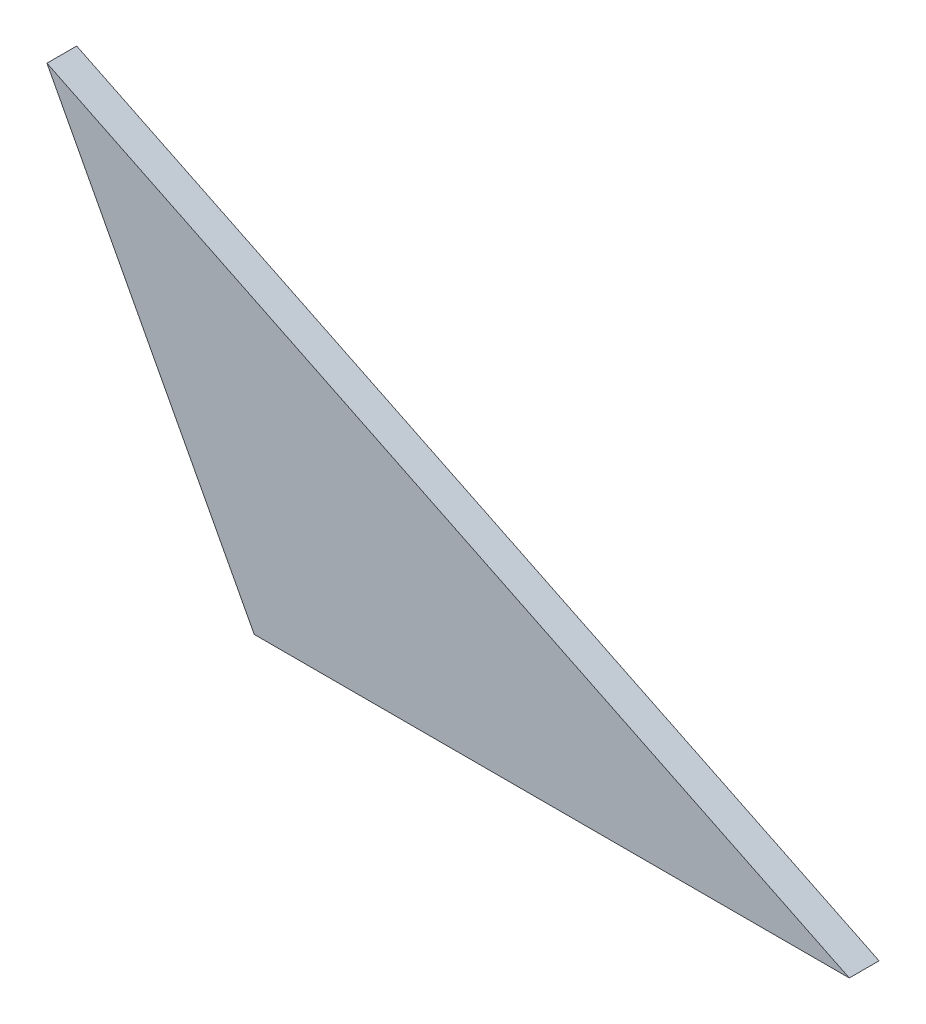
ISO-10303-21;
HEADER;
FILE_DESCRIPTION(('STEP AP214'),'2;1');
FILE_NAME('part.step','',(''),(''),'','','');
FILE_SCHEMA(('AUTOMOTIVE_DESIGN { 1 0 10303 214 1 1 1 1 }'));
ENDSEC;
DATA;
#1=APPLICATION_CONTEXT('core data for automotive mechanical design processes');
#2=APPLICATION_PROTOCOL_DEFINITION('international standard','automotive_design',2000,#1);
#3=PRODUCT_CONTEXT('',#1,'mechanical');
#4=PRODUCT('Part','Part','',(#3));
#5=PRODUCT_RELATED_PRODUCT_CATEGORY('part','',(#4));
#6=PRODUCT_DEFINITION_FORMATION('','',#4);
#7=PRODUCT_DEFINITION_CONTEXT('part definition',#1,'design');
#8=PRODUCT_DEFINITION('design','',#6,#7);
#9=PRODUCT_DEFINITION_SHAPE('','',#8);
#10=(LENGTH_UNIT() NAMED_UNIT(*) SI_UNIT(.MILLI.,.METRE.));
#11=(NAMED_UNIT(*) PLANE_ANGLE_UNIT() SI_UNIT($,.RADIAN.));
#12=(NAMED_UNIT(*) SI_UNIT($,.STERADIAN.) SOLID_ANGLE_UNIT());
#13=UNCERTAINTY_MEASURE_WITH_UNIT(LENGTH_MEASURE(1.E-05),#10,'distance_accuracy_value','');
#14=(GEOMETRIC_REPRESENTATION_CONTEXT(3) GLOBAL_UNCERTAINTY_ASSIGNED_CONTEXT((#13)) GLOBAL_UNIT_ASSIGNED_CONTEXT((#10,
#11,#12)) REPRESENTATION_CONTEXT('',''));
#15=CARTESIAN_POINT('',(0.,0.,0.));
#16=DIRECTION('',(0.,0.,1.));
#17=DIRECTION('',(1.,0.,0.));
#18=AXIS2_PLACEMENT_3D('',#15,#16,#17);
#19=CARTESIAN_POINT('',(0.,0.177099347747704,0.01));
#20=DIRECTION('',(-0.438121050049227,-0.898915983562292,0.));
#21=DIRECTION('',(0.898915983562292,-0.438121050049227,0.));
#22=AXIS2_PLACEMENT_3D('',#19,#20,#21);
#23=PLANE('',#22);
#24=DIRECTION('',(-0.898915983562292,0.438121050049227,0.));
#25=VECTOR('',#24,1.);
#26=CARTESIAN_POINT('',(0.,0.177099347747704,-0.01));
#27=LINE('',#26,#25);
#28=CARTESIAN_POINT('',(0.539349590137375,-0.085773282281832,-0.01));
#29=VERTEX_POINT('',#28);
#30=CARTESIAN_POINT('',(0.,0.177099347747704,-0.01));
#31=VERTEX_POINT('',#30);
#32=EDGE_CURVE('E80',#29,#31,#27,.T.);
#33=ORIENTED_EDGE('',*,*,#32,.T.);
#34=DIRECTION('',(0.,0.,-1.));
#35=VECTOR('',#34,1.);
#36=CARTESIAN_POINT('',(0.,0.177099347747704,0.01));
#37=LINE('',#36,#35);
#38=CARTESIAN_POINT('',(0.,0.177099347747704,0.01));
#39=VERTEX_POINT('',#38);
#40=EDGE_CURVE('E11',#39,#31,#37,.T.);
#41=ORIENTED_EDGE('',*,*,#40,.F.);
#42=DIRECTION('',(-0.898915983562292,0.438121050049227,0.));
#43=VECTOR('',#42,1.);
#44=CARTESIAN_POINT('',(0.,0.177099347747704,0.01));
#45=LINE('',#44,#43);
#46=CARTESIAN_POINT('',(0.539349590137375,-0.085773282281832,0.01));
#47=VERTEX_POINT('',#46);
#48=EDGE_CURVE('E73',#47,#39,#45,.T.);
#49=ORIENTED_EDGE('',*,*,#48,.F.);
#50=DIRECTION('',(0.,0.,-1.));
#51=VECTOR('',#50,1.);
#52=CARTESIAN_POINT('',(0.539349590137375,-0.085773282281832,0.01));
#53=LINE('',#52,#51);
#54=EDGE_CURVE('E81',#47,#29,#53,.T.);
#55=ORIENTED_EDGE('',*,*,#54,.T.);
#56=EDGE_LOOP('',(#33,#41,#49,#55));
#57=FACE_BOUND('',#56,.T.);
#58=ADVANCED_FACE('F33',(#57),#23,.F.);
#59=CARTESIAN_POINT('',(0.,0.177099347747704,0.01));
#60=DIRECTION('',(0.883535213900185,0.468364735861224,0.));
#61=DIRECTION('',(-0.468364735861224,0.883535213900185,0.));
#62=AXIS2_PLACEMENT_3D('',#59,#60,#61);
#63=PLANE('',#62);
#64=DIRECTION('',(0.468364735861224,-0.883535213900185,0.));
#65=VECTOR('',#64,1.);
#66=CARTESIAN_POINT('',(0.,0.177099347747704,-0.01));
#67=LINE('',#66,#65);
#68=CARTESIAN_POINT('',(0.139349590137375,-0.085773282281832,-0.01));
#69=VERTEX_POINT('',#68);
#70=EDGE_CURVE('E61',#31,#69,#67,.T.);
#71=ORIENTED_EDGE('',*,*,#70,.T.);
#72=DIRECTION('',(0.,0.,-1.));
#73=VECTOR('',#72,1.);
#74=CARTESIAN_POINT('',(0.139349590137375,-0.085773282281832,0.01));
#75=LINE('',#74,#73);
#76=CARTESIAN_POINT('',(0.139349590137375,-0.085773282281832,0.01));
#77=VERTEX_POINT('',#76);
#78=EDGE_CURVE('E41',#77,#69,#75,.T.);
#79=ORIENTED_EDGE('',*,*,#78,.F.);
#80=DIRECTION('',(0.468364735861224,-0.883535213900185,0.));
#81=VECTOR('',#80,1.);
#82=CARTESIAN_POINT('',(0.,0.177099347747704,0.01));
#83=LINE('',#82,#81);
#84=EDGE_CURVE('E69',#39,#77,#83,.T.);
#85=ORIENTED_EDGE('',*,*,#84,.F.);
#86=ORIENTED_EDGE('',*,*,#40,.T.);
#87=EDGE_LOOP('',(#71,#79,#85,#86));
#88=FACE_BOUND('',#87,.T.);
#89=ADVANCED_FACE('F70',(#88),#63,.F.);
#90=CARTESIAN_POINT('',(0.139349590137375,-0.085773282281832,0.01));
#91=DIRECTION('',(0.,1.,0.));
#92=DIRECTION('',(0.,0.,1.));
#93=AXIS2_PLACEMENT_3D('',#90,#91,#92);
#94=PLANE('',#93);
#95=DIRECTION('',(1.,0.,0.));
#96=VECTOR('',#95,1.);
#97=CARTESIAN_POINT('',(0.139349590137375,-0.085773282281832,-0.01));
#98=LINE('',#97,#96);
#99=EDGE_CURVE('E66',#69,#29,#98,.T.);
#100=ORIENTED_EDGE('',*,*,#99,.T.);
#101=ORIENTED_EDGE('',*,*,#54,.F.);
#102=DIRECTION('',(1.,0.,0.));
#103=VECTOR('',#102,1.);
#104=CARTESIAN_POINT('',(0.139349590137375,-0.085773282281832,0.01));
#105=LINE('',#104,#103);
#106=EDGE_CURVE('E49',#77,#47,#105,.T.);
#107=ORIENTED_EDGE('',*,*,#106,.F.);
#108=ORIENTED_EDGE('',*,*,#78,.T.);
#109=EDGE_LOOP('',(#100,#101,#107,#108));
#110=FACE_BOUND('',#109,.T.);
#111=ADVANCED_FACE('F88',(#110),#94,.F.);
#112=CARTESIAN_POINT('',(0.,0.,0.01));
#113=DIRECTION('',(0.,0.,-1.));
#114=DIRECTION('',(-1.,0.,0.));
#115=AXIS2_PLACEMENT_3D('',#112,#113,#114);
#116=PLANE('',#115);
#117=ORIENTED_EDGE('',*,*,#48,.T.);
#118=ORIENTED_EDGE('',*,*,#84,.T.);
#119=ORIENTED_EDGE('',*,*,#106,.T.);
#120=EDGE_LOOP('',(#117,#118,#119));
#121=FACE_BOUND('',#120,.T.);
#122=ADVANCED_FACE('F76',(#121),#116,.F.);
#123=CARTESIAN_POINT('',(0.,0.,-0.01));
#124=DIRECTION('',(0.,0.,-1.));
#125=DIRECTION('',(-1.,0.,0.));
#126=AXIS2_PLACEMENT_3D('',#123,#124,#125);
#127=PLANE('',#126);
#128=ORIENTED_EDGE('',*,*,#32,.F.);
#129=ORIENTED_EDGE('',*,*,#99,.F.);
#130=ORIENTED_EDGE('',*,*,#70,.F.);
#131=EDGE_LOOP('',(#128,#129,#130));
#132=FACE_BOUND('',#131,.T.);
#133=ADVANCED_FACE('F89',(#132),#127,.T.);
#134=CLOSED_SHELL('',(#58,#89,#111,#122,#133));
#135=MANIFOLD_SOLID_BREP('B2',#134);
#136=ADVANCED_BREP_SHAPE_REPRESENTATION('',(#18,#135),#14);
#137=SHAPE_DEFINITION_REPRESENTATION(#9,#136);
ENDSEC;
END-ISO-10303-21;
